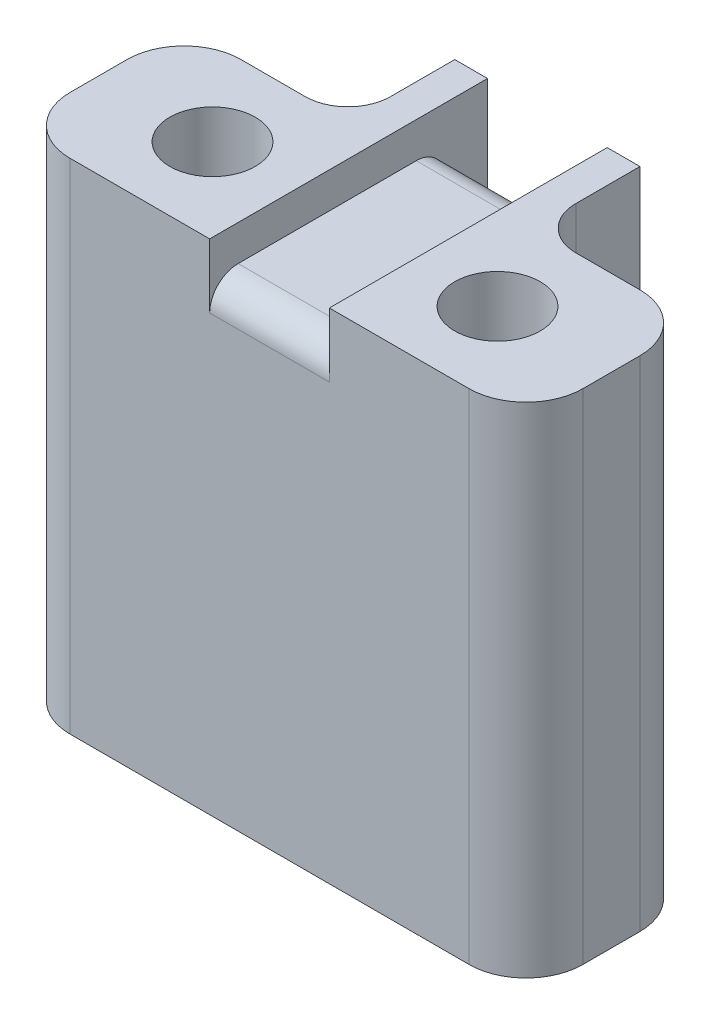
ISO-10303-21;
HEADER;
FILE_DESCRIPTION(('STEP AP214'),'2;1');
FILE_NAME('part.step','',(''),(''),'','','');
FILE_SCHEMA(('AUTOMOTIVE_DESIGN { 1 0 10303 214 1 1 1 1 }'));
ENDSEC;
DATA;
#1=APPLICATION_CONTEXT('core data for automotive mechanical design processes');
#2=APPLICATION_PROTOCOL_DEFINITION('international standard','automotive_design',2000,#1);
#3=PRODUCT_CONTEXT('',#1,'mechanical');
#4=PRODUCT('Part','Part','',(#3));
#5=PRODUCT_RELATED_PRODUCT_CATEGORY('part','',(#4));
#6=PRODUCT_DEFINITION_FORMATION('','',#4);
#7=PRODUCT_DEFINITION_CONTEXT('part definition',#1,'design');
#8=PRODUCT_DEFINITION('design','',#6,#7);
#9=PRODUCT_DEFINITION_SHAPE('','',#8);
#10=(LENGTH_UNIT() NAMED_UNIT(*) SI_UNIT(.MILLI.,.METRE.));
#11=(NAMED_UNIT(*) PLANE_ANGLE_UNIT() SI_UNIT($,.RADIAN.));
#12=(NAMED_UNIT(*) SI_UNIT($,.STERADIAN.) SOLID_ANGLE_UNIT());
#13=UNCERTAINTY_MEASURE_WITH_UNIT(LENGTH_MEASURE(1.E-05),#10,'distance_accuracy_value','');
#14=(GEOMETRIC_REPRESENTATION_CONTEXT(3) GLOBAL_UNCERTAINTY_ASSIGNED_CONTEXT((#13)) GLOBAL_UNIT_ASSIGNED_CONTEXT((#10,
#11,#12)) REPRESENTATION_CONTEXT('',''));
#15=CARTESIAN_POINT('',(0.,0.,0.));
#16=DIRECTION('',(0.,0.,1.));
#17=DIRECTION('',(1.,0.,0.));
#18=AXIS2_PLACEMENT_3D('',#15,#16,#17);
#19=CARTESIAN_POINT('',(0.,0.,-6.75));
#20=DIRECTION('',(0.,0.,-1.));
#21=DIRECTION('',(-1.,0.,0.));
#22=AXIS2_PLACEMENT_3D('',#19,#20,#21);
#23=PLANE('',#22);
#24=DIRECTION('',(0.,1.,0.));
#25=VECTOR('',#24,1.);
#26=CARTESIAN_POINT('',(3.25,0.,-6.75));
#27=LINE('',#26,#25);
#28=CARTESIAN_POINT('',(3.25,13.75,-6.75));
#29=VERTEX_POINT('',#28);
#30=CARTESIAN_POINT('',(3.25,17.5,-6.75));
#31=VERTEX_POINT('',#30);
#32=EDGE_CURVE('E417',#29,#31,#27,.T.);
#33=ORIENTED_EDGE('',*,*,#32,.F.);
#34=DIRECTION('',(-1.,0.,0.));
#35=VECTOR('',#34,1.);
#36=CARTESIAN_POINT('',(-3.25,13.75,-6.75));
#37=LINE('',#36,#35);
#38=CARTESIAN_POINT('',(2.1,13.75,-6.75));
#39=VERTEX_POINT('',#38);
#40=EDGE_CURVE('E384',#29,#39,#37,.T.);
#41=ORIENTED_EDGE('',*,*,#40,.T.);
#42=DIRECTION('',(0.,1.,0.));
#43=VECTOR('',#42,1.);
#44=CARTESIAN_POINT('',(2.1,0.,-6.75));
#45=LINE('',#44,#43);
#46=CARTESIAN_POINT('',(2.1,17.5,-6.75));
#47=VERTEX_POINT('',#46);
#48=EDGE_CURVE('E408',#39,#47,#45,.T.);
#49=ORIENTED_EDGE('',*,*,#48,.T.);
#50=DIRECTION('',(1.,0.,0.));
#51=VECTOR('',#50,1.);
#52=CARTESIAN_POINT('',(0.,17.5,-6.75));
#53=LINE('',#52,#51);
#54=EDGE_CURVE('E423',#47,#31,#53,.T.);
#55=ORIENTED_EDGE('',*,*,#54,.T.);
#56=EDGE_LOOP('',(#33,#41,#49,#55));
#57=FACE_BOUND('',#56,.T.);
#58=ADVANCED_FACE('F47',(#57),#23,.T.);
#59=CARTESIAN_POINT('',(0.,17.5,0.));
#60=DIRECTION('',(0.,-1.,0.));
#61=DIRECTION('',(0.,0.,-1.));
#62=AXIS2_PLACEMENT_3D('',#59,#60,#61);
#63=PLANE('',#62);
#64=CARTESIAN_POINT('',(5.,17.5,0.));
#65=DIRECTION('',(0.,-1.,0.));
#66=DIRECTION('',(0.,0.,-1.));
#67=AXIS2_PLACEMENT_3D('',#64,#65,#66);
#68=CIRCLE('',#67,1.5);
#69=CARTESIAN_POINT('',(5.,17.5,-1.5));
#70=VERTEX_POINT('',#69);
#71=EDGE_CURVE('E461',#70,#70,#68,.T.);
#72=ORIENTED_EDGE('',*,*,#71,.T.);
#73=EDGE_LOOP('',(#72));
#74=FACE_BOUND('',#73,.T.);
#75=DIRECTION('',(0.,0.,1.));
#76=VECTOR('',#75,1.);
#77=CARTESIAN_POINT('',(2.1,17.5,-6.75));
#78=LINE('',#77,#76);
#79=CARTESIAN_POINT('',(2.1,17.5,3.));
#80=VERTEX_POINT('',#79);
#81=EDGE_CURVE('E445',#47,#80,#78,.T.);
#82=ORIENTED_EDGE('',*,*,#81,.T.);
#83=DIRECTION('',(1.,0.,0.));
#84=VECTOR('',#83,1.);
#85=CARTESIAN_POINT('',(-9.,17.5,3.));
#86=LINE('',#85,#84);
#87=CARTESIAN_POINT('',(7.,17.5,3.));
#88=VERTEX_POINT('',#87);
#89=EDGE_CURVE('E243',#80,#88,#86,.T.);
#90=ORIENTED_EDGE('',*,*,#89,.T.);
#91=CARTESIAN_POINT('',(7.,17.5,1.));
#92=DIRECTION('',(0.,-1.,0.));
#93=DIRECTION('',(0.,0.,-1.));
#94=AXIS2_PLACEMENT_3D('',#91,#92,#93);
#95=CIRCLE('',#94,2.);
#96=CARTESIAN_POINT('',(9.,17.5,1.));
#97=VERTEX_POINT('',#96);
#98=EDGE_CURVE('E299',#88,#97,#95,.F.);
#99=ORIENTED_EDGE('',*,*,#98,.T.);
#100=DIRECTION('',(0.,0.,-1.));
#101=VECTOR('',#100,1.);
#102=CARTESIAN_POINT('',(9.,17.5,3.));
#103=LINE('',#102,#101);
#104=CARTESIAN_POINT('',(9.,17.5,-1.));
#105=VERTEX_POINT('',#104);
#106=EDGE_CURVE('E270',#97,#105,#103,.T.);
#107=ORIENTED_EDGE('',*,*,#106,.T.);
#108=CARTESIAN_POINT('',(7.,17.5,-1.));
#109=DIRECTION('',(0.,-1.,0.));
#110=DIRECTION('',(0.,0.,-1.));
#111=AXIS2_PLACEMENT_3D('',#108,#109,#110);
#112=CIRCLE('',#111,2.);
#113=CARTESIAN_POINT('',(7.,17.5,-3.));
#114=VERTEX_POINT('',#113);
#115=EDGE_CURVE('E296',#105,#114,#112,.F.);
#116=ORIENTED_EDGE('',*,*,#115,.T.);
#117=DIRECTION('',(-1.,0.,0.));
#118=VECTOR('',#117,1.);
#119=CARTESIAN_POINT('',(-9.,17.5,-3.));
#120=LINE('',#119,#118);
#121=CARTESIAN_POINT('',(4.75,17.5,-3.));
#122=VERTEX_POINT('',#121);
#123=EDGE_CURVE('E471',#114,#122,#120,.T.);
#124=ORIENTED_EDGE('',*,*,#123,.T.);
#125=CARTESIAN_POINT('',(4.75,17.5,-4.5));
#126=DIRECTION('',(0.,-1.,0.));
#127=DIRECTION('',(0.,0.,-1.));
#128=AXIS2_PLACEMENT_3D('',#125,#126,#127);
#129=CIRCLE('',#128,1.5);
#130=CARTESIAN_POINT('',(3.25,17.5,-4.5));
#131=VERTEX_POINT('',#130);
#132=EDGE_CURVE('E369',#122,#131,#129,.T.);
#133=ORIENTED_EDGE('',*,*,#132,.T.);
#134=DIRECTION('',(0.,0.,1.));
#135=VECTOR('',#134,1.);
#136=CARTESIAN_POINT('',(3.25,17.5,-6.75));
#137=LINE('',#136,#135);
#138=EDGE_CURVE('E442',#31,#131,#137,.T.);
#139=ORIENTED_EDGE('',*,*,#138,.F.);
#140=ORIENTED_EDGE('',*,*,#54,.F.);
#141=EDGE_LOOP('',(#82,#90,#99,#107,#116,#124,#133,#139,#140));
#142=FACE_BOUND('',#141,.T.);
#143=ADVANCED_FACE('F507',(#74,#142),#63,.F.);
#144=CARTESIAN_POINT('',(-9.,17.5,3.));
#145=DIRECTION('',(0.,0.,-1.));
#146=DIRECTION('',(-1.,0.,0.));
#147=AXIS2_PLACEMENT_3D('',#144,#145,#146);
#148=PLANE('',#147);
#149=DIRECTION('',(0.,1.,0.));
#150=VECTOR('',#149,1.);
#151=CARTESIAN_POINT('',(2.1,16.25,3.));
#152=LINE('',#151,#150);
#153=CARTESIAN_POINT('',(2.1,15.25,3.));
#154=VERTEX_POINT('',#153);
#155=EDGE_CURVE('E233',#154,#80,#152,.T.);
#156=ORIENTED_EDGE('',*,*,#155,.F.);
#157=DIRECTION('',(1.,0.,0.));
#158=VECTOR('',#157,1.);
#159=CARTESIAN_POINT('',(-2.1,15.25,3.));
#160=LINE('',#159,#158);
#161=CARTESIAN_POINT('',(-2.1,15.25,3.));
#162=VERTEX_POINT('',#161);
#163=EDGE_CURVE('E230',#154,#162,#160,.F.);
#164=ORIENTED_EDGE('',*,*,#163,.T.);
#165=DIRECTION('',(0.,1.,0.));
#166=VECTOR('',#165,1.);
#167=CARTESIAN_POINT('',(-2.1,16.25,3.));
#168=LINE('',#167,#166);
#169=CARTESIAN_POINT('',(-2.1,17.5,3.));
#170=VERTEX_POINT('',#169);
#171=EDGE_CURVE('E211',#162,#170,#168,.T.);
#172=ORIENTED_EDGE('',*,*,#171,.T.);
#173=CARTESIAN_POINT('',(-7.,17.5,3.));
#174=VERTEX_POINT('',#173);
#175=EDGE_CURVE('E227',#174,#170,#86,.T.);
#176=ORIENTED_EDGE('',*,*,#175,.F.);
#177=DIRECTION('',(0.,-1.,0.));
#178=VECTOR('',#177,1.);
#179=CARTESIAN_POINT('',(-7.,17.5,3.));
#180=LINE('',#179,#178);
#181=CARTESIAN_POINT('',(-7.,0.,3.));
#182=VERTEX_POINT('',#181);
#183=EDGE_CURVE('E248',#174,#182,#180,.T.);
#184=ORIENTED_EDGE('',*,*,#183,.T.);
#185=DIRECTION('',(1.,0.,0.));
#186=VECTOR('',#185,1.);
#187=CARTESIAN_POINT('',(-9.,0.,3.));
#188=LINE('',#187,#186);
#189=CARTESIAN_POINT('',(7.,0.,3.));
#190=VERTEX_POINT('',#189);
#191=EDGE_CURVE('E267',#182,#190,#188,.T.);
#192=ORIENTED_EDGE('',*,*,#191,.T.);
#193=DIRECTION('',(0.,-1.,0.));
#194=VECTOR('',#193,1.);
#195=CARTESIAN_POINT('',(7.,17.5,3.));
#196=LINE('',#195,#194);
#197=EDGE_CURVE('E242',#190,#88,#196,.F.);
#198=ORIENTED_EDGE('',*,*,#197,.T.);
#199=ORIENTED_EDGE('',*,*,#89,.F.);
#200=EDGE_LOOP('',(#156,#164,#172,#176,#184,#192,#198,#199));
#201=FACE_BOUND('',#200,.T.);
#202=ADVANCED_FACE('F225',(#201),#148,.F.);
#203=CARTESIAN_POINT('',(0.,0.,-5.25));
#204=DIRECTION('',(0.,0.,-1.));
#205=DIRECTION('',(-1.,0.,0.));
#206=AXIS2_PLACEMENT_3D('',#203,#204,#205);
#207=PLANE('',#206);
#208=DIRECTION('',(0.,1.,0.));
#209=VECTOR('',#208,1.);
#210=CARTESIAN_POINT('',(-2.1,13.5,-5.25));
#211=LINE('',#210,#209);
#212=CARTESIAN_POINT('',(-2.1,13.5,-5.25));
#213=VERTEX_POINT('',#212);
#214=CARTESIAN_POINT('',(-2.1,15.25,-5.25));
#215=VERTEX_POINT('',#214);
#216=EDGE_CURVE('E409',#213,#215,#211,.T.);
#217=ORIENTED_EDGE('',*,*,#216,.T.);
#218=DIRECTION('',(-1.,0.,0.));
#219=VECTOR('',#218,1.);
#220=CARTESIAN_POINT('',(0.,15.25,-5.25));
#221=LINE('',#220,#219);
#222=CARTESIAN_POINT('',(2.1,15.25,-5.25));
#223=VERTEX_POINT('',#222);
#224=EDGE_CURVE('E329',#215,#223,#221,.F.);
#225=ORIENTED_EDGE('',*,*,#224,.T.);
#226=DIRECTION('',(0.,-1.,0.));
#227=VECTOR('',#226,1.);
#228=CARTESIAN_POINT('',(2.1,17.5,-5.25));
#229=LINE('',#228,#227);
#230=CARTESIAN_POINT('',(2.1,13.5,-5.25));
#231=VERTEX_POINT('',#230);
#232=EDGE_CURVE('E534',#223,#231,#229,.T.);
#233=ORIENTED_EDGE('',*,*,#232,.T.);
#234=DIRECTION('',(-1.,0.,0.));
#235=VECTOR('',#234,1.);
#236=CARTESIAN_POINT('',(2.1,13.5,-5.25));
#237=LINE('',#236,#235);
#238=EDGE_CURVE('E538',#231,#213,#237,.T.);
#239=ORIENTED_EDGE('',*,*,#238,.T.);
#240=EDGE_LOOP('',(#217,#225,#233,#239));
#241=FACE_BOUND('',#240,.T.);
#242=ADVANCED_FACE('F555',(#241),#207,.T.);
#243=ORIENTED_EDGE('',*,*,#175,.T.);
#244=DIRECTION('',(0.,0.,1.));
#245=VECTOR('',#244,1.);
#246=CARTESIAN_POINT('',(-2.1,17.5,-6.75));
#247=LINE('',#246,#245);
#248=CARTESIAN_POINT('',(-2.1,17.5,-6.75));
#249=VERTEX_POINT('',#248);
#250=EDGE_CURVE('E207',#249,#170,#247,.T.);
#251=ORIENTED_EDGE('',*,*,#250,.F.);
#252=CARTESIAN_POINT('',(-3.25,17.5,-6.75));
#253=VERTEX_POINT('',#252);
#254=EDGE_CURVE('E221',#253,#249,#53,.T.);
#255=ORIENTED_EDGE('',*,*,#254,.F.);
#256=DIRECTION('',(0.,0.,1.));
#257=VECTOR('',#256,1.);
#258=CARTESIAN_POINT('',(-3.25,17.5,-6.75));
#259=LINE('',#258,#257);
#260=CARTESIAN_POINT('',(-3.25,17.5,-4.5));
#261=VERTEX_POINT('',#260);
#262=EDGE_CURVE('E220',#253,#261,#259,.T.);
#263=ORIENTED_EDGE('',*,*,#262,.T.);
#264=CARTESIAN_POINT('',(-4.75,17.5,-4.5));
#265=DIRECTION('',(0.,-1.,0.));
#266=DIRECTION('',(0.,0.,-1.));
#267=AXIS2_PLACEMENT_3D('',#264,#265,#266);
#268=CIRCLE('',#267,1.5);
#269=CARTESIAN_POINT('',(-4.75,17.5,-3.));
#270=VERTEX_POINT('',#269);
#271=EDGE_CURVE('E366',#261,#270,#268,.T.);
#272=ORIENTED_EDGE('',*,*,#271,.T.);
#273=CARTESIAN_POINT('',(-7.,17.5,-3.));
#274=VERTEX_POINT('',#273);
#275=EDGE_CURVE('E470',#270,#274,#120,.T.);
#276=ORIENTED_EDGE('',*,*,#275,.T.);
#277=CARTESIAN_POINT('',(-7.,17.5,-1.));
#278=DIRECTION('',(0.,-1.,0.));
#279=DIRECTION('',(0.,0.,-1.));
#280=AXIS2_PLACEMENT_3D('',#277,#278,#279);
#281=CIRCLE('',#280,2.);
#282=CARTESIAN_POINT('',(-9.,17.5,-1.));
#283=VERTEX_POINT('',#282);
#284=EDGE_CURVE('E293',#274,#283,#281,.F.);
#285=ORIENTED_EDGE('',*,*,#284,.T.);
#286=DIRECTION('',(0.,0.,1.));
#287=VECTOR('',#286,1.);
#288=CARTESIAN_POINT('',(-9.,17.5,3.));
#289=LINE('',#288,#287);
#290=CARTESIAN_POINT('',(-9.,17.5,1.));
#291=VERTEX_POINT('',#290);
#292=EDGE_CURVE('E250',#283,#291,#289,.T.);
#293=ORIENTED_EDGE('',*,*,#292,.T.);
#294=CARTESIAN_POINT('',(-7.,17.5,1.));
#295=DIRECTION('',(0.,-1.,0.));
#296=DIRECTION('',(0.,0.,-1.));
#297=AXIS2_PLACEMENT_3D('',#294,#295,#296);
#298=CIRCLE('',#297,2.);
#299=EDGE_CURVE('E240',#291,#174,#298,.F.);
#300=ORIENTED_EDGE('',*,*,#299,.T.);
#301=EDGE_LOOP('',(#243,#251,#255,#263,#272,#276,#285,#293,#300));
#302=FACE_BOUND('',#301,.T.);
#303=CARTESIAN_POINT('',(-5.,17.5,0.));
#304=DIRECTION('',(0.,1.,0.));
#305=DIRECTION('',(0.,0.,1.));
#306=AXIS2_PLACEMENT_3D('',#303,#304,#305);
#307=CIRCLE('',#306,1.5);
#308=CARTESIAN_POINT('',(-5.,17.5,1.5));
#309=VERTEX_POINT('',#308);
#310=EDGE_CURVE('E457',#309,#309,#307,.T.);
#311=ORIENTED_EDGE('',*,*,#310,.F.);
#312=EDGE_LOOP('',(#311));
#313=FACE_BOUND('',#312,.T.);
#314=ADVANCED_FACE('F236',(#302,#313),#63,.F.);
#315=CARTESIAN_POINT('',(0.,0.,0.));
#316=DIRECTION('',(0.,-1.,0.));
#317=DIRECTION('',(0.,0.,-1.));
#318=AXIS2_PLACEMENT_3D('',#315,#316,#317);
#319=PLANE('',#318);
#320=CARTESIAN_POINT('',(5.,0.,0.));
#321=DIRECTION('',(0.,-1.,0.));
#322=DIRECTION('',(0.,0.,-1.));
#323=AXIS2_PLACEMENT_3D('',#320,#321,#322);
#324=CIRCLE('',#323,1.5);
#325=CARTESIAN_POINT('',(5.,0.,-1.5));
#326=VERTEX_POINT('',#325);
#327=EDGE_CURVE('E453',#326,#326,#324,.T.);
#328=ORIENTED_EDGE('',*,*,#327,.F.);
#329=EDGE_LOOP('',(#328));
#330=FACE_BOUND('',#329,.T.);
#331=ORIENTED_EDGE('',*,*,#191,.F.);
#332=CARTESIAN_POINT('',(-7.,0.,1.));
#333=DIRECTION('',(0.,-1.,0.));
#334=DIRECTION('',(0.,0.,-1.));
#335=AXIS2_PLACEMENT_3D('',#332,#333,#334);
#336=CIRCLE('',#335,2.);
#337=CARTESIAN_POINT('',(-9.,0.,1.));
#338=VERTEX_POINT('',#337);
#339=EDGE_CURVE('E283',#182,#338,#336,.T.);
#340=ORIENTED_EDGE('',*,*,#339,.T.);
#341=DIRECTION('',(0.,0.,1.));
#342=VECTOR('',#341,1.);
#343=CARTESIAN_POINT('',(-9.,0.,3.));
#344=LINE('',#343,#342);
#345=CARTESIAN_POINT('',(-9.,0.,-1.));
#346=VERTEX_POINT('',#345);
#347=EDGE_CURVE('E263',#346,#338,#344,.T.);
#348=ORIENTED_EDGE('',*,*,#347,.F.);
#349=CARTESIAN_POINT('',(-7.,0.,-1.));
#350=DIRECTION('',(0.,-1.,0.));
#351=DIRECTION('',(0.,0.,-1.));
#352=AXIS2_PLACEMENT_3D('',#349,#350,#351);
#353=CIRCLE('',#352,2.);
#354=CARTESIAN_POINT('',(-7.,0.,-3.));
#355=VERTEX_POINT('',#354);
#356=EDGE_CURVE('E274',#346,#355,#353,.T.);
#357=ORIENTED_EDGE('',*,*,#356,.T.);
#358=DIRECTION('',(-1.,0.,0.));
#359=VECTOR('',#358,1.);
#360=CARTESIAN_POINT('',(-9.,0.,-3.));
#361=LINE('',#360,#359);
#362=CARTESIAN_POINT('',(7.,0.,-3.));
#363=VERTEX_POINT('',#362);
#364=EDGE_CURVE('E258',#363,#355,#361,.T.);
#365=ORIENTED_EDGE('',*,*,#364,.F.);
#366=CARTESIAN_POINT('',(7.,0.,-1.));
#367=DIRECTION('',(0.,-1.,0.));
#368=DIRECTION('',(0.,0.,-1.));
#369=AXIS2_PLACEMENT_3D('',#366,#367,#368);
#370=CIRCLE('',#369,2.);
#371=CARTESIAN_POINT('',(9.,0.,-1.));
#372=VERTEX_POINT('',#371);
#373=EDGE_CURVE('E277',#363,#372,#370,.T.);
#374=ORIENTED_EDGE('',*,*,#373,.T.);
#375=DIRECTION('',(0.,0.,-1.));
#376=VECTOR('',#375,1.);
#377=CARTESIAN_POINT('',(9.,0.,3.));
#378=LINE('',#377,#376);
#379=CARTESIAN_POINT('',(9.,0.,1.));
#380=VERTEX_POINT('',#379);
#381=EDGE_CURVE('E254',#380,#372,#378,.T.);
#382=ORIENTED_EDGE('',*,*,#381,.F.);
#383=CARTESIAN_POINT('',(7.,0.,1.));
#384=DIRECTION('',(0.,-1.,0.));
#385=DIRECTION('',(0.,0.,-1.));
#386=AXIS2_PLACEMENT_3D('',#383,#384,#385);
#387=CIRCLE('',#386,2.);
#388=EDGE_CURVE('E280',#380,#190,#387,.T.);
#389=ORIENTED_EDGE('',*,*,#388,.T.);
#390=EDGE_LOOP('',(#331,#340,#348,#357,#365,#374,#382,#389));
#391=FACE_BOUND('',#390,.T.);
#392=CARTESIAN_POINT('',(-5.,0.,0.));
#393=DIRECTION('',(0.,1.,0.));
#394=DIRECTION('',(0.,0.,1.));
#395=AXIS2_PLACEMENT_3D('',#392,#393,#394);
#396=CIRCLE('',#395,1.5);
#397=CARTESIAN_POINT('',(-5.,0.,1.5));
#398=VERTEX_POINT('',#397);
#399=EDGE_CURVE('E259',#398,#398,#396,.T.);
#400=ORIENTED_EDGE('',*,*,#399,.T.);
#401=EDGE_LOOP('',(#400));
#402=FACE_BOUND('',#401,.T.);
#403=ADVANCED_FACE('F496',(#330,#391,#402),#319,.T.);
#404=CARTESIAN_POINT('',(9.,17.5,3.));
#405=DIRECTION('',(-1.,0.,0.));
#406=DIRECTION('',(0.,0.,1.));
#407=AXIS2_PLACEMENT_3D('',#404,#405,#406);
#408=PLANE('',#407);
#409=ORIENTED_EDGE('',*,*,#106,.F.);
#410=DIRECTION('',(0.,-1.,0.));
#411=VECTOR('',#410,1.);
#412=CARTESIAN_POINT('',(9.,17.5,1.));
#413=LINE('',#412,#411);
#414=EDGE_CURVE('E307',#97,#380,#413,.T.);
#415=ORIENTED_EDGE('',*,*,#414,.T.);
#416=ORIENTED_EDGE('',*,*,#381,.T.);
#417=DIRECTION('',(0.,-1.,0.));
#418=VECTOR('',#417,1.);
#419=CARTESIAN_POINT('',(9.,17.5,-1.));
#420=LINE('',#419,#418);
#421=EDGE_CURVE('E304',#372,#105,#420,.F.);
#422=ORIENTED_EDGE('',*,*,#421,.T.);
#423=EDGE_LOOP('',(#409,#415,#416,#422));
#424=FACE_BOUND('',#423,.T.);
#425=ADVANCED_FACE('F510',(#424),#408,.F.);
#426=CARTESIAN_POINT('',(-9.,17.5,-3.));
#427=DIRECTION('',(0.,0.,1.));
#428=DIRECTION('',(1.,0.,0.));
#429=AXIS2_PLACEMENT_3D('',#426,#427,#428);
#430=PLANE('',#429);
#431=ORIENTED_EDGE('',*,*,#275,.F.);
#432=DIRECTION('',(0.,1.,0.));
#433=VECTOR('',#432,1.);
#434=CARTESIAN_POINT('',(-4.75,13.,-3.));
#435=LINE('',#434,#433);
#436=CARTESIAN_POINT('',(-4.75,11.5,-3.));
#437=VERTEX_POINT('',#436);
#438=EDGE_CURVE('E355',#270,#437,#435,.F.);
#439=ORIENTED_EDGE('',*,*,#438,.T.);
#440=DIRECTION('',(-1.,0.,0.));
#441=VECTOR('',#440,1.);
#442=CARTESIAN_POINT('',(3.25,11.5,-3.));
#443=LINE('',#442,#441);
#444=CARTESIAN_POINT('',(4.75,11.5,-3.));
#445=VERTEX_POINT('',#444);
#446=EDGE_CURVE('E349',#437,#445,#443,.F.);
#447=ORIENTED_EDGE('',*,*,#446,.T.);
#448=DIRECTION('',(0.,1.,0.));
#449=VECTOR('',#448,1.);
#450=CARTESIAN_POINT('',(4.75,17.5,-3.));
#451=LINE('',#450,#449);
#452=EDGE_CURVE('E352',#445,#122,#451,.T.);
#453=ORIENTED_EDGE('',*,*,#452,.T.);
#454=ORIENTED_EDGE('',*,*,#123,.F.);
#455=DIRECTION('',(0.,-1.,0.));
#456=VECTOR('',#455,1.);
#457=CARTESIAN_POINT('',(7.,17.5,-3.));
#458=LINE('',#457,#456);
#459=EDGE_CURVE('E315',#114,#363,#458,.T.);
#460=ORIENTED_EDGE('',*,*,#459,.T.);
#461=ORIENTED_EDGE('',*,*,#364,.T.);
#462=DIRECTION('',(0.,-1.,0.));
#463=VECTOR('',#462,1.);
#464=CARTESIAN_POINT('',(-7.,17.5,-3.));
#465=LINE('',#464,#463);
#466=EDGE_CURVE('E311',#355,#274,#465,.F.);
#467=ORIENTED_EDGE('',*,*,#466,.T.);
#468=EDGE_LOOP('',(#431,#439,#447,#453,#454,#460,#461,#467));
#469=FACE_BOUND('',#468,.T.);
#470=ADVANCED_FACE('F485',(#469),#430,.F.);
#471=CARTESIAN_POINT('',(-9.,17.5,3.));
#472=DIRECTION('',(1.,0.,0.));
#473=DIRECTION('',(0.,0.,-1.));
#474=AXIS2_PLACEMENT_3D('',#471,#472,#473);
#475=PLANE('',#474);
#476=ORIENTED_EDGE('',*,*,#347,.T.);
#477=DIRECTION('',(0.,-1.,0.));
#478=VECTOR('',#477,1.);
#479=CARTESIAN_POINT('',(-9.,17.5,1.));
#480=LINE('',#479,#478);
#481=EDGE_CURVE('E290',#338,#291,#480,.F.);
#482=ORIENTED_EDGE('',*,*,#481,.T.);
#483=ORIENTED_EDGE('',*,*,#292,.F.);
#484=DIRECTION('',(0.,-1.,0.));
#485=VECTOR('',#484,1.);
#486=CARTESIAN_POINT('',(-9.,17.5,-1.));
#487=LINE('',#486,#485);
#488=EDGE_CURVE('E286',#283,#346,#487,.T.);
#489=ORIENTED_EDGE('',*,*,#488,.T.);
#490=EDGE_LOOP('',(#476,#482,#483,#489));
#491=FACE_BOUND('',#490,.T.);
#492=ADVANCED_FACE('F492',(#491),#475,.F.);
#493=CARTESIAN_POINT('',(5.,0.,0.));
#494=DIRECTION('',(0.,1.,0.));
#495=DIRECTION('',(0.,0.,1.));
#496=AXIS2_PLACEMENT_3D('',#493,#494,#495);
#497=CYLINDRICAL_SURFACE('',#496,1.5);
#498=ORIENTED_EDGE('',*,*,#327,.T.);
#499=EDGE_LOOP('',(#498));
#500=FACE_BOUND('',#499,.T.);
#501=ORIENTED_EDGE('',*,*,#71,.F.);
#502=EDGE_LOOP('',(#501));
#503=FACE_BOUND('',#502,.T.);
#504=ADVANCED_FACE('F612',(#500,#503),#497,.F.);
#505=CARTESIAN_POINT('',(-5.,0.,0.));
#506=DIRECTION('',(0.,1.,0.));
#507=DIRECTION('',(0.,0.,1.));
#508=AXIS2_PLACEMENT_3D('',#505,#506,#507);
#509=CYLINDRICAL_SURFACE('',#508,1.5);
#510=ORIENTED_EDGE('',*,*,#399,.F.);
#511=EDGE_LOOP('',(#510));
#512=FACE_BOUND('',#511,.T.);
#513=ORIENTED_EDGE('',*,*,#310,.T.);
#514=EDGE_LOOP('',(#513));
#515=FACE_BOUND('',#514,.T.);
#516=ADVANCED_FACE('F609',(#512,#515),#509,.F.);
#517=CARTESIAN_POINT('',(-7.,17.5,1.));
#518=DIRECTION('',(0.,-1.,0.));
#519=DIRECTION('',(0.,0.,-1.));
#520=AXIS2_PLACEMENT_3D('',#517,#518,#519);
#521=CYLINDRICAL_SURFACE('',#520,2.);
#522=ORIENTED_EDGE('',*,*,#299,.F.);
#523=ORIENTED_EDGE('',*,*,#481,.F.);
#524=ORIENTED_EDGE('',*,*,#339,.F.);
#525=ORIENTED_EDGE('',*,*,#183,.F.);
#526=EDGE_LOOP('',(#522,#523,#524,#525));
#527=FACE_BOUND('',#526,.T.);
#528=ADVANCED_FACE('F499',(#527),#521,.T.);
#529=CARTESIAN_POINT('',(7.,17.5,1.));
#530=DIRECTION('',(0.,-1.,0.));
#531=DIRECTION('',(0.,0.,-1.));
#532=AXIS2_PLACEMENT_3D('',#529,#530,#531);
#533=CYLINDRICAL_SURFACE('',#532,2.);
#534=ORIENTED_EDGE('',*,*,#98,.F.);
#535=ORIENTED_EDGE('',*,*,#197,.F.);
#536=ORIENTED_EDGE('',*,*,#388,.F.);
#537=ORIENTED_EDGE('',*,*,#414,.F.);
#538=EDGE_LOOP('',(#534,#535,#536,#537));
#539=FACE_BOUND('',#538,.T.);
#540=ADVANCED_FACE('F504',(#539),#533,.T.);
#541=CARTESIAN_POINT('',(7.,17.5,-1.));
#542=DIRECTION('',(0.,-1.,0.));
#543=DIRECTION('',(0.,0.,-1.));
#544=AXIS2_PLACEMENT_3D('',#541,#542,#543);
#545=CYLINDRICAL_SURFACE('',#544,2.);
#546=ORIENTED_EDGE('',*,*,#115,.F.);
#547=ORIENTED_EDGE('',*,*,#421,.F.);
#548=ORIENTED_EDGE('',*,*,#373,.F.);
#549=ORIENTED_EDGE('',*,*,#459,.F.);
#550=EDGE_LOOP('',(#546,#547,#548,#549));
#551=FACE_BOUND('',#550,.T.);
#552=ADVANCED_FACE('F514',(#551),#545,.T.);
#553=CARTESIAN_POINT('',(-7.,17.5,-1.));
#554=DIRECTION('',(0.,-1.,0.));
#555=DIRECTION('',(0.,0.,-1.));
#556=AXIS2_PLACEMENT_3D('',#553,#554,#555);
#557=CYLINDRICAL_SURFACE('',#556,2.);
#558=ORIENTED_EDGE('',*,*,#284,.F.);
#559=ORIENTED_EDGE('',*,*,#466,.F.);
#560=ORIENTED_EDGE('',*,*,#356,.F.);
#561=ORIENTED_EDGE('',*,*,#488,.F.);
#562=EDGE_LOOP('',(#558,#559,#560,#561));
#563=FACE_BOUND('',#562,.T.);
#564=ADVANCED_FACE('F489',(#563),#557,.T.);
#565=CARTESIAN_POINT('',(-2.1,0.,-6.75));
#566=DIRECTION('',(1.,0.,0.));
#567=DIRECTION('',(0.,0.,-1.));
#568=AXIS2_PLACEMENT_3D('',#565,#566,#567);
#569=PLANE('',#568);
#570=DIRECTION('',(0.,0.,1.));
#571=VECTOR('',#570,1.);
#572=CARTESIAN_POINT('',(-2.1,13.5,-6.75));
#573=LINE('',#572,#571);
#574=CARTESIAN_POINT('',(-2.1,13.5,-6.70710678118655));
#575=VERTEX_POINT('',#574);
#576=EDGE_CURVE('E401',#575,#213,#573,.T.);
#577=ORIENTED_EDGE('',*,*,#576,.F.);
#578=CARTESIAN_POINT('',(-2.1,13.75,-6.));
#579=DIRECTION('',(1.,0.,0.));
#580=DIRECTION('',(0.,0.,-1.));
#581=AXIS2_PLACEMENT_3D('',#578,#579,#580);
#582=CIRCLE('',#581,0.75);
#583=CARTESIAN_POINT('',(-2.1,13.75,-6.75));
#584=VERTEX_POINT('',#583);
#585=EDGE_CURVE('E394',#575,#584,#582,.T.);
#586=ORIENTED_EDGE('',*,*,#585,.T.);
#587=DIRECTION('',(0.,1.,0.));
#588=VECTOR('',#587,1.);
#589=CARTESIAN_POINT('',(-2.1,0.,-6.75));
#590=LINE('',#589,#588);
#591=EDGE_CURVE('E214',#584,#249,#590,.T.);
#592=ORIENTED_EDGE('',*,*,#591,.T.);
#593=ORIENTED_EDGE('',*,*,#250,.T.);
#594=ORIENTED_EDGE('',*,*,#171,.F.);
#595=CARTESIAN_POINT('',(-2.1,15.25,2.));
#596=DIRECTION('',(1.,0.,0.));
#597=DIRECTION('',(0.,0.,-1.));
#598=AXIS2_PLACEMENT_3D('',#595,#596,#597);
#599=CIRCLE('',#598,1.);
#600=CARTESIAN_POINT('',(-2.1,16.25,2.));
#601=VERTEX_POINT('',#600);
#602=EDGE_CURVE('E336',#162,#601,#599,.F.);
#603=ORIENTED_EDGE('',*,*,#602,.T.);
#604=DIRECTION('',(0.,0.,1.));
#605=VECTOR('',#604,1.);
#606=CARTESIAN_POINT('',(-2.1,16.25,0.));
#607=LINE('',#606,#605);
#608=CARTESIAN_POINT('',(-2.1,16.25,-4.25));
#609=VERTEX_POINT('',#608);
#610=EDGE_CURVE('E234',#609,#601,#607,.T.);
#611=ORIENTED_EDGE('',*,*,#610,.F.);
#612=CARTESIAN_POINT('',(-2.1,15.25,-4.25));
#613=DIRECTION('',(1.,0.,0.));
#614=DIRECTION('',(0.,0.,-1.));
#615=AXIS2_PLACEMENT_3D('',#612,#613,#614);
#616=CIRCLE('',#615,1.);
#617=EDGE_CURVE('E339',#609,#215,#616,.F.);
#618=ORIENTED_EDGE('',*,*,#617,.T.);
#619=ORIENTED_EDGE('',*,*,#216,.F.);
#620=EDGE_LOOP('',(#577,#586,#592,#593,#594,#603,#611,#618,#619));
#621=FACE_BOUND('',#620,.T.);
#622=ADVANCED_FACE('F210',(#621),#569,.T.);
#623=CARTESIAN_POINT('',(0.,13.5,-6.75));
#624=DIRECTION('',(0.,1.,0.));
#625=DIRECTION('',(0.,0.,1.));
#626=AXIS2_PLACEMENT_3D('',#623,#624,#625);
#627=PLANE('',#626);
#628=DIRECTION('',(0.,0.,1.));
#629=VECTOR('',#628,1.);
#630=CARTESIAN_POINT('',(2.1,13.5,-6.75));
#631=LINE('',#630,#629);
#632=CARTESIAN_POINT('',(2.1,13.5,-6.70710678118655));
#633=VERTEX_POINT('',#632);
#634=EDGE_CURVE('E448',#633,#231,#631,.T.);
#635=ORIENTED_EDGE('',*,*,#634,.F.);
#636=DIRECTION('',(1.,0.,0.));
#637=VECTOR('',#636,1.);
#638=CARTESIAN_POINT('',(2.1,13.5,-6.70710678118655));
#639=LINE('',#638,#637);
#640=EDGE_CURVE('E391',#633,#575,#639,.F.);
#641=ORIENTED_EDGE('',*,*,#640,.T.);
#642=ORIENTED_EDGE('',*,*,#576,.T.);
#643=ORIENTED_EDGE('',*,*,#238,.F.);
#644=EDGE_LOOP('',(#635,#641,#642,#643));
#645=FACE_BOUND('',#644,.T.);
#646=ADVANCED_FACE('F553',(#645),#627,.T.);
#647=CARTESIAN_POINT('',(2.1,0.,-6.75));
#648=DIRECTION('',(1.,0.,0.));
#649=DIRECTION('',(0.,0.,-1.));
#650=AXIS2_PLACEMENT_3D('',#647,#648,#649);
#651=PLANE('',#650);
#652=ORIENTED_EDGE('',*,*,#48,.F.);
#653=CARTESIAN_POINT('',(2.1,13.75,-6.));
#654=DIRECTION('',(1.,0.,0.));
#655=DIRECTION('',(0.,0.,-1.));
#656=AXIS2_PLACEMENT_3D('',#653,#654,#655);
#657=CIRCLE('',#656,0.75);
#658=EDGE_CURVE('E388',#39,#633,#657,.F.);
#659=ORIENTED_EDGE('',*,*,#658,.T.);
#660=ORIENTED_EDGE('',*,*,#634,.T.);
#661=ORIENTED_EDGE('',*,*,#232,.F.);
#662=CARTESIAN_POINT('',(2.1,15.25,-4.25));
#663=DIRECTION('',(1.,0.,0.));
#664=DIRECTION('',(0.,0.,-1.));
#665=AXIS2_PLACEMENT_3D('',#662,#663,#664);
#666=CIRCLE('',#665,1.);
#667=CARTESIAN_POINT('',(2.1,16.25,-4.25));
#668=VERTEX_POINT('',#667);
#669=EDGE_CURVE('E342',#223,#668,#666,.T.);
#670=ORIENTED_EDGE('',*,*,#669,.T.);
#671=DIRECTION('',(0.,0.,1.));
#672=VECTOR('',#671,1.);
#673=CARTESIAN_POINT('',(2.1,16.25,0.));
#674=LINE('',#673,#672);
#675=CARTESIAN_POINT('',(2.1,16.25,2.));
#676=VERTEX_POINT('',#675);
#677=EDGE_CURVE('E381',#668,#676,#674,.T.);
#678=ORIENTED_EDGE('',*,*,#677,.T.);
#679=CARTESIAN_POINT('',(2.1,15.25,2.));
#680=DIRECTION('',(1.,0.,0.));
#681=DIRECTION('',(0.,0.,-1.));
#682=AXIS2_PLACEMENT_3D('',#679,#680,#681);
#683=CIRCLE('',#682,1.);
#684=EDGE_CURVE('E332',#676,#154,#683,.T.);
#685=ORIENTED_EDGE('',*,*,#684,.T.);
#686=ORIENTED_EDGE('',*,*,#155,.T.);
#687=ORIENTED_EDGE('',*,*,#81,.F.);
#688=EDGE_LOOP('',(#652,#659,#660,#661,#670,#678,#685,#686,#687));
#689=FACE_BOUND('',#688,.T.);
#690=ADVANCED_FACE('F531',(#689),#651,.F.);
#691=CARTESIAN_POINT('',(3.25,0.,-6.75));
#692=DIRECTION('',(1.,0.,0.));
#693=DIRECTION('',(0.,0.,-1.));
#694=AXIS2_PLACEMENT_3D('',#691,#692,#693);
#695=PLANE('',#694);
#696=DIRECTION('',(0.,0.,1.));
#697=VECTOR('',#696,1.);
#698=CARTESIAN_POINT('',(3.25,13.,-6.75));
#699=LINE('',#698,#697);
#700=CARTESIAN_POINT('',(3.25,13.,-6.));
#701=VERTEX_POINT('',#700);
#702=CARTESIAN_POINT('',(3.25,13.,-4.5));
#703=VERTEX_POINT('',#702);
#704=EDGE_CURVE('E419',#701,#703,#699,.T.);
#705=ORIENTED_EDGE('',*,*,#704,.F.);
#706=CARTESIAN_POINT('',(3.25,13.75,-6.));
#707=DIRECTION('',(1.,0.,0.));
#708=DIRECTION('',(0.,0.,-1.));
#709=AXIS2_PLACEMENT_3D('',#706,#707,#708);
#710=CIRCLE('',#709,0.75);
#711=EDGE_CURVE('E11',#701,#29,#710,.T.);
#712=ORIENTED_EDGE('',*,*,#711,.T.);
#713=ORIENTED_EDGE('',*,*,#32,.T.);
#714=ORIENTED_EDGE('',*,*,#138,.T.);
#715=DIRECTION('',(0.,1.,0.));
#716=VECTOR('',#715,1.);
#717=CARTESIAN_POINT('',(3.25,0.,-4.5));
#718=LINE('',#717,#716);
#719=EDGE_CURVE('E358',#131,#703,#718,.F.);
#720=ORIENTED_EDGE('',*,*,#719,.T.);
#721=EDGE_LOOP('',(#705,#712,#713,#714,#720));
#722=FACE_BOUND('',#721,.T.);
#723=ADVANCED_FACE('F415',(#722),#695,.T.);
#724=CARTESIAN_POINT('',(0.,13.,-6.75));
#725=DIRECTION('',(0.,1.,0.));
#726=DIRECTION('',(0.,0.,1.));
#727=AXIS2_PLACEMENT_3D('',#724,#725,#726);
#728=PLANE('',#727);
#729=DIRECTION('',(0.,0.,1.));
#730=VECTOR('',#729,1.);
#731=CARTESIAN_POINT('',(-3.25,13.,-6.75));
#732=LINE('',#731,#730);
#733=CARTESIAN_POINT('',(-3.25,13.,-6.));
#734=VERTEX_POINT('',#733);
#735=CARTESIAN_POINT('',(-3.25,13.,-4.5));
#736=VERTEX_POINT('',#735);
#737=EDGE_CURVE('E437',#734,#736,#732,.T.);
#738=ORIENTED_EDGE('',*,*,#737,.F.);
#739=DIRECTION('',(-1.,0.,0.));
#740=VECTOR('',#739,1.);
#741=CARTESIAN_POINT('',(3.25,13.,-6.));
#742=LINE('',#741,#740);
#743=EDGE_CURVE('E56',#734,#701,#742,.F.);
#744=ORIENTED_EDGE('',*,*,#743,.T.);
#745=ORIENTED_EDGE('',*,*,#704,.T.);
#746=DIRECTION('',(-1.,0.,0.));
#747=VECTOR('',#746,1.);
#748=CARTESIAN_POINT('',(-3.25,13.,-4.5));
#749=LINE('',#748,#747);
#750=EDGE_CURVE('E362',#703,#736,#749,.T.);
#751=ORIENTED_EDGE('',*,*,#750,.T.);
#752=EDGE_LOOP('',(#738,#744,#745,#751));
#753=FACE_BOUND('',#752,.T.);
#754=ADVANCED_FACE('F527',(#753),#728,.F.);
#755=CARTESIAN_POINT('',(-3.25,0.,-6.75));
#756=DIRECTION('',(1.,0.,0.));
#757=DIRECTION('',(0.,0.,-1.));
#758=AXIS2_PLACEMENT_3D('',#755,#756,#757);
#759=PLANE('',#758);
#760=DIRECTION('',(0.,1.,0.));
#761=VECTOR('',#760,1.);
#762=CARTESIAN_POINT('',(-3.25,0.,-6.75));
#763=LINE('',#762,#761);
#764=CARTESIAN_POINT('',(-3.25,13.75,-6.75));
#765=VERTEX_POINT('',#764);
#766=EDGE_CURVE('E426',#765,#253,#763,.T.);
#767=ORIENTED_EDGE('',*,*,#766,.F.);
#768=CARTESIAN_POINT('',(-3.25,13.75,-6.));
#769=DIRECTION('',(1.,0.,0.));
#770=DIRECTION('',(0.,0.,-1.));
#771=AXIS2_PLACEMENT_3D('',#768,#769,#770);
#772=CIRCLE('',#771,0.75);
#773=EDGE_CURVE('E70',#765,#734,#772,.F.);
#774=ORIENTED_EDGE('',*,*,#773,.T.);
#775=ORIENTED_EDGE('',*,*,#737,.T.);
#776=DIRECTION('',(0.,1.,0.));
#777=VECTOR('',#776,1.);
#778=CARTESIAN_POINT('',(-3.25,17.5,-4.5));
#779=LINE('',#778,#777);
#780=EDGE_CURVE('E345',#736,#261,#779,.T.);
#781=ORIENTED_EDGE('',*,*,#780,.T.);
#782=ORIENTED_EDGE('',*,*,#262,.F.);
#783=EDGE_LOOP('',(#767,#774,#775,#781,#782));
#784=FACE_BOUND('',#783,.T.);
#785=ADVANCED_FACE('F592',(#784),#759,.F.);
#786=ORIENTED_EDGE('',*,*,#591,.F.);
#787=DIRECTION('',(-1.,0.,0.));
#788=VECTOR('',#787,1.);
#789=CARTESIAN_POINT('',(-3.25,13.75,-6.75));
#790=LINE('',#789,#788);
#791=EDGE_CURVE('E372',#584,#765,#790,.T.);
#792=ORIENTED_EDGE('',*,*,#791,.T.);
#793=ORIENTED_EDGE('',*,*,#766,.T.);
#794=ORIENTED_EDGE('',*,*,#254,.T.);
#795=EDGE_LOOP('',(#786,#792,#793,#794));
#796=FACE_BOUND('',#795,.T.);
#797=ADVANCED_FACE('F406',(#796),#23,.T.);
#798=CARTESIAN_POINT('',(0.,16.25,0.));
#799=DIRECTION('',(0.,1.,0.));
#800=DIRECTION('',(0.,0.,1.));
#801=AXIS2_PLACEMENT_3D('',#798,#799,#800);
#802=PLANE('',#801);
#803=ORIENTED_EDGE('',*,*,#610,.T.);
#804=DIRECTION('',(1.,0.,0.));
#805=VECTOR('',#804,1.);
#806=CARTESIAN_POINT('',(2.1,16.25,2.));
#807=LINE('',#806,#805);
#808=EDGE_CURVE('E323',#601,#676,#807,.T.);
#809=ORIENTED_EDGE('',*,*,#808,.T.);
#810=ORIENTED_EDGE('',*,*,#677,.F.);
#811=DIRECTION('',(-1.,0.,0.));
#812=VECTOR('',#811,1.);
#813=CARTESIAN_POINT('',(0.,16.25,-4.25));
#814=LINE('',#813,#812);
#815=EDGE_CURVE('E319',#668,#609,#814,.T.);
#816=ORIENTED_EDGE('',*,*,#815,.T.);
#817=EDGE_LOOP('',(#803,#809,#810,#816));
#818=FACE_BOUND('',#817,.T.);
#819=ADVANCED_FACE('F565',(#818),#802,.T.);
#820=CARTESIAN_POINT('',(0.,15.25,2.));
#821=DIRECTION('',(-1.,0.,0.));
#822=DIRECTION('',(0.,0.,1.));
#823=AXIS2_PLACEMENT_3D('',#820,#821,#822);
#824=CYLINDRICAL_SURFACE('',#823,1.);
#825=ORIENTED_EDGE('',*,*,#602,.F.);
#826=ORIENTED_EDGE('',*,*,#163,.F.);
#827=ORIENTED_EDGE('',*,*,#684,.F.);
#828=ORIENTED_EDGE('',*,*,#808,.F.);
#829=EDGE_LOOP('',(#825,#826,#827,#828));
#830=FACE_BOUND('',#829,.T.);
#831=ADVANCED_FACE('F570',(#830),#824,.T.);
#832=CARTESIAN_POINT('',(0.,15.25,-4.25));
#833=DIRECTION('',(-1.,0.,0.));
#834=DIRECTION('',(0.,0.,1.));
#835=AXIS2_PLACEMENT_3D('',#832,#833,#834);
#836=CYLINDRICAL_SURFACE('',#835,1.);
#837=ORIENTED_EDGE('',*,*,#669,.F.);
#838=ORIENTED_EDGE('',*,*,#224,.F.);
#839=ORIENTED_EDGE('',*,*,#617,.F.);
#840=ORIENTED_EDGE('',*,*,#815,.F.);
#841=EDGE_LOOP('',(#837,#838,#839,#840));
#842=FACE_BOUND('',#841,.T.);
#843=ADVANCED_FACE('F562',(#842),#836,.T.);
#844=CARTESIAN_POINT('',(4.75,17.5,-4.5));
#845=DIRECTION('',(0.,1.,0.));
#846=DIRECTION('',(0.,0.,1.));
#847=AXIS2_PLACEMENT_3D('',#844,#845,#846);
#848=CYLINDRICAL_SURFACE('',#847,1.5);
#849=ORIENTED_EDGE('',*,*,#132,.F.);
#850=ORIENTED_EDGE('',*,*,#452,.F.);
#851=CARTESIAN_POINT('',(4.75,11.5,-4.5));
#852=DIRECTION('',(0.707106781186547,0.707106781186547,0.));
#853=DIRECTION('',(0.707106781186547,-0.707106781186547,0.));
#854=AXIS2_PLACEMENT_3D('',#851,#852,#853);
#855=ELLIPSE('',#854,2.12132034355964,1.5);
#856=EDGE_CURVE('E377',#703,#445,#855,.T.);
#857=ORIENTED_EDGE('',*,*,#856,.F.);
#858=ORIENTED_EDGE('',*,*,#719,.F.);
#859=EDGE_LOOP('',(#849,#850,#857,#858));
#860=FACE_BOUND('',#859,.T.);
#861=ADVANCED_FACE('F520',(#860),#848,.F.);
#862=CARTESIAN_POINT('',(0.,11.5,-4.5));
#863=DIRECTION('',(1.,0.,0.));
#864=DIRECTION('',(0.,0.,-1.));
#865=AXIS2_PLACEMENT_3D('',#862,#863,#864);
#866=CYLINDRICAL_SURFACE('',#865,1.5);
#867=ORIENTED_EDGE('',*,*,#856,.T.);
#868=ORIENTED_EDGE('',*,*,#446,.F.);
#869=CARTESIAN_POINT('',(-4.75,11.5,-4.5));
#870=DIRECTION('',(0.707106781186547,-0.707106781186547,0.));
#871=DIRECTION('',(0.707106781186547,0.707106781186547,0.));
#872=AXIS2_PLACEMENT_3D('',#869,#870,#871);
#873=ELLIPSE('',#872,2.12132034355964,1.5);
#874=EDGE_CURVE('E373',#736,#437,#873,.T.);
#875=ORIENTED_EDGE('',*,*,#874,.F.);
#876=ORIENTED_EDGE('',*,*,#750,.F.);
#877=EDGE_LOOP('',(#867,#868,#875,#876));
#878=FACE_BOUND('',#877,.T.);
#879=ADVANCED_FACE('F524',(#878),#866,.F.);
#880=CARTESIAN_POINT('',(-4.75,0.,-4.5));
#881=DIRECTION('',(0.,-1.,0.));
#882=DIRECTION('',(0.,0.,-1.));
#883=AXIS2_PLACEMENT_3D('',#880,#881,#882);
#884=CYLINDRICAL_SURFACE('',#883,1.5);
#885=ORIENTED_EDGE('',*,*,#874,.T.);
#886=ORIENTED_EDGE('',*,*,#438,.F.);
#887=ORIENTED_EDGE('',*,*,#271,.F.);
#888=ORIENTED_EDGE('',*,*,#780,.F.);
#889=EDGE_LOOP('',(#885,#886,#887,#888));
#890=FACE_BOUND('',#889,.T.);
#891=ADVANCED_FACE('F688',(#890),#884,.F.);
#892=CARTESIAN_POINT('',(0.,13.75,-6.));
#893=DIRECTION('',(1.,0.,0.));
#894=DIRECTION('',(0.,0.,-1.));
#895=AXIS2_PLACEMENT_3D('',#892,#893,#894);
#896=CYLINDRICAL_SURFACE('',#895,0.75);
#897=ORIENTED_EDGE('',*,*,#711,.F.);
#898=ORIENTED_EDGE('',*,*,#743,.F.);
#899=ORIENTED_EDGE('',*,*,#773,.F.);
#900=ORIENTED_EDGE('',*,*,#791,.F.);
#901=ORIENTED_EDGE('',*,*,#585,.F.);
#902=ORIENTED_EDGE('',*,*,#640,.F.);
#903=ORIENTED_EDGE('',*,*,#658,.F.);
#904=ORIENTED_EDGE('',*,*,#40,.F.);
#905=EDGE_LOOP('',(#897,#898,#899,#900,#901,#902,#903,#904));
#906=FACE_BOUND('',#905,.T.);
#907=ADVANCED_FACE('F49',(#906),#896,.T.);
#908=CLOSED_SHELL('',(#58,#143,#202,#242,#314,#403,#425,#470,#492,#504,#516,#528,#540,#552,#564,
#622,#646,#690,#723,#754,#785,#797,#819,#831,#843,#861,#879,#891,#907));
#909=MANIFOLD_SOLID_BREP('B2',#908);
#910=ADVANCED_BREP_SHAPE_REPRESENTATION('',(#18,#909),#14);
#911=SHAPE_DEFINITION_REPRESENTATION(#9,#910);
ENDSEC;
END-ISO-10303-21;
